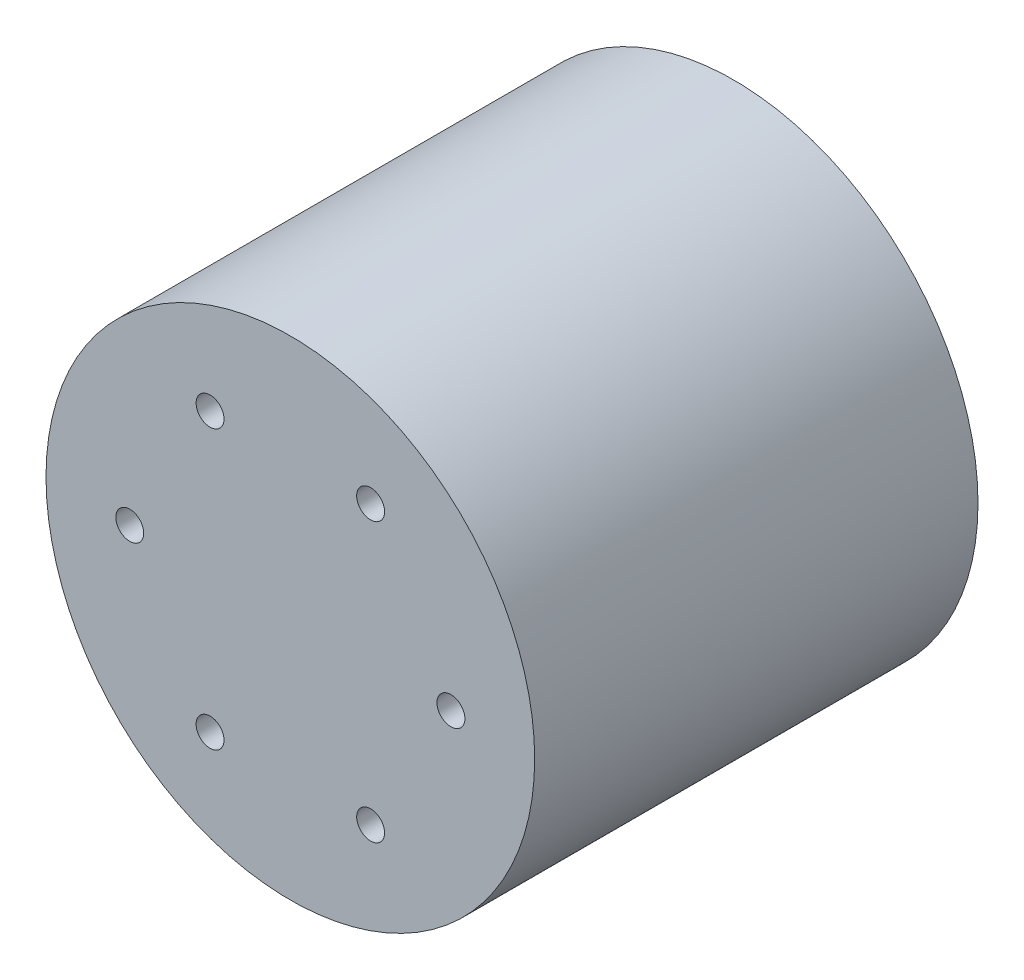
ISO-10303-21;
HEADER;
FILE_DESCRIPTION(('STEP AP214'),'2;1');
FILE_NAME('part.step','',(''),(''),'','','');
FILE_SCHEMA(('AUTOMOTIVE_DESIGN { 1 0 10303 214 1 1 1 1 }'));
ENDSEC;
DATA;
#1=APPLICATION_CONTEXT('core data for automotive mechanical design processes');
#2=APPLICATION_PROTOCOL_DEFINITION('international standard','automotive_design',2000,#1);
#3=PRODUCT_CONTEXT('',#1,'mechanical');
#4=PRODUCT('Part','Part','',(#3));
#5=PRODUCT_RELATED_PRODUCT_CATEGORY('part','',(#4));
#6=PRODUCT_DEFINITION_FORMATION('','',#4);
#7=PRODUCT_DEFINITION_CONTEXT('part definition',#1,'design');
#8=PRODUCT_DEFINITION('design','',#6,#7);
#9=PRODUCT_DEFINITION_SHAPE('','',#8);
#10=(LENGTH_UNIT() NAMED_UNIT(*) SI_UNIT(.MILLI.,.METRE.));
#11=(NAMED_UNIT(*) PLANE_ANGLE_UNIT() SI_UNIT($,.RADIAN.));
#12=(NAMED_UNIT(*) SI_UNIT($,.STERADIAN.) SOLID_ANGLE_UNIT());
#13=UNCERTAINTY_MEASURE_WITH_UNIT(LENGTH_MEASURE(1.E-05),#10,'distance_accuracy_value','');
#14=(GEOMETRIC_REPRESENTATION_CONTEXT(3) GLOBAL_UNCERTAINTY_ASSIGNED_CONTEXT((#13)) GLOBAL_UNIT_ASSIGNED_CONTEXT((#10,
#11,#12)) REPRESENTATION_CONTEXT('',''));
#15=CARTESIAN_POINT('',(0.,0.,0.));
#16=DIRECTION('',(0.,0.,1.));
#17=DIRECTION('',(1.,0.,0.));
#18=AXIS2_PLACEMENT_3D('',#15,#16,#17);
#19=CARTESIAN_POINT('',(0.,0.,63.5));
#20=DIRECTION('',(0.,0.,-1.));
#21=DIRECTION('',(-1.,0.,0.));
#22=AXIS2_PLACEMENT_3D('',#19,#20,#21);
#23=CYLINDRICAL_SURFACE('',#22,35.);
#24=CARTESIAN_POINT('',(0.,0.,63.5));
#25=DIRECTION('',(0.,0.,1.));
#26=DIRECTION('',(1.,0.,0.));
#27=AXIS2_PLACEMENT_3D('',#24,#25,#26);
#28=CIRCLE('',#27,35.);
#29=CARTESIAN_POINT('',(35.,0.,63.5));
#30=VERTEX_POINT('',#29);
#31=EDGE_CURVE('E10',#30,#30,#28,.T.);
#32=ORIENTED_EDGE('',*,*,#31,.F.);
#33=EDGE_LOOP('',(#32));
#34=FACE_BOUND('',#33,.T.);
#35=CARTESIAN_POINT('',(0.,0.,0.));
#36=DIRECTION('',(0.,0.,1.));
#37=DIRECTION('',(1.,0.,0.));
#38=AXIS2_PLACEMENT_3D('',#35,#36,#37);
#39=CIRCLE('',#38,35.);
#40=CARTESIAN_POINT('',(35.,0.,0.));
#41=VERTEX_POINT('',#40);
#42=EDGE_CURVE('E40',#41,#41,#39,.T.);
#43=ORIENTED_EDGE('',*,*,#42,.T.);
#44=EDGE_LOOP('',(#43));
#45=FACE_BOUND('',#44,.T.);
#46=ADVANCED_FACE('F37',(#34,#45),#23,.T.);
#47=CARTESIAN_POINT('',(0.,0.,63.5));
#48=DIRECTION('',(0.,0.,1.));
#49=DIRECTION('',(1.,0.,0.));
#50=AXIS2_PLACEMENT_3D('',#47,#48,#49);
#51=PLANE('',#50);
#52=CARTESIAN_POINT('',(-23.,0.,63.5));
#53=DIRECTION('',(0.,0.,1.));
#54=DIRECTION('',(1.,0.,0.));
#55=AXIS2_PLACEMENT_3D('',#52,#53,#54);
#56=CIRCLE('',#55,2.);
#57=CARTESIAN_POINT('',(-21.,0.,63.5));
#58=VERTEX_POINT('',#57);
#59=EDGE_CURVE('E55',#58,#58,#56,.T.);
#60=ORIENTED_EDGE('',*,*,#59,.F.);
#61=EDGE_LOOP('',(#60));
#62=FACE_BOUND('',#61,.T.);
#63=CARTESIAN_POINT('',(11.5000000000001,19.918584287042,63.5));
#64=DIRECTION('',(0.,0.,1.));
#65=DIRECTION('',(1.,0.,0.));
#66=AXIS2_PLACEMENT_3D('',#63,#64,#65);
#67=CIRCLE('',#66,2.);
#68=CARTESIAN_POINT('',(13.5000000000001,19.918584287042,63.5));
#69=VERTEX_POINT('',#68);
#70=EDGE_CURVE('E62',#69,#69,#67,.T.);
#71=ORIENTED_EDGE('',*,*,#70,.F.);
#72=EDGE_LOOP('',(#71));
#73=FACE_BOUND('',#72,.T.);
#74=CARTESIAN_POINT('',(23.,-1.60608141586784E-13,63.5));
#75=DIRECTION('',(0.,0.,1.));
#76=DIRECTION('',(1.,0.,0.));
#77=AXIS2_PLACEMENT_3D('',#74,#75,#76);
#78=CIRCLE('',#77,2.);
#79=CARTESIAN_POINT('',(25.,-1.60608141586784E-13,63.5));
#80=VERTEX_POINT('',#79);
#81=EDGE_CURVE('E68',#80,#80,#78,.T.);
#82=ORIENTED_EDGE('',*,*,#81,.F.);
#83=EDGE_LOOP('',(#82));
#84=FACE_BOUND('',#83,.T.);
#85=CARTESIAN_POINT('',(11.4999999999998,-19.9185842870422,63.5));
#86=DIRECTION('',(0.,0.,1.));
#87=DIRECTION('',(1.,0.,0.));
#88=AXIS2_PLACEMENT_3D('',#85,#86,#87);
#89=CIRCLE('',#88,2.);
#90=CARTESIAN_POINT('',(13.4999999999998,-19.9185842870422,63.5));
#91=VERTEX_POINT('',#90);
#92=EDGE_CURVE('E74',#91,#91,#89,.T.);
#93=ORIENTED_EDGE('',*,*,#92,.F.);
#94=EDGE_LOOP('',(#93));
#95=FACE_BOUND('',#94,.T.);
#96=CARTESIAN_POINT('',(-11.5000000000002,-19.918584287042,63.5));
#97=DIRECTION('',(0.,0.,1.));
#98=DIRECTION('',(1.,0.,0.));
#99=AXIS2_PLACEMENT_3D('',#96,#97,#98);
#100=CIRCLE('',#99,2.);
#101=CARTESIAN_POINT('',(-9.50000000000023,-19.918584287042,63.5));
#102=VERTEX_POINT('',#101);
#103=EDGE_CURVE('E80',#102,#102,#100,.T.);
#104=ORIENTED_EDGE('',*,*,#103,.F.);
#105=EDGE_LOOP('',(#104));
#106=FACE_BOUND('',#105,.T.);
#107=CARTESIAN_POINT('',(-11.5,19.9185842870421,63.5));
#108=DIRECTION('',(0.,0.,1.));
#109=DIRECTION('',(1.,0.,0.));
#110=AXIS2_PLACEMENT_3D('',#107,#108,#109);
#111=CIRCLE('',#110,2.);
#112=CARTESIAN_POINT('',(-9.49999999999995,19.9185842870421,63.5));
#113=VERTEX_POINT('',#112);
#114=EDGE_CURVE('E49',#113,#113,#111,.T.);
#115=ORIENTED_EDGE('',*,*,#114,.F.);
#116=EDGE_LOOP('',(#115));
#117=FACE_BOUND('',#116,.T.);
#118=ORIENTED_EDGE('',*,*,#31,.T.);
#119=EDGE_LOOP('',(#118));
#120=FACE_BOUND('',#119,.T.);
#121=ADVANCED_FACE('F138',(#62,#73,#84,#95,#106,#117,#120),#51,.T.);
#122=CARTESIAN_POINT('',(0.,0.,0.));
#123=DIRECTION('',(0.,0.,1.));
#124=DIRECTION('',(1.,0.,0.));
#125=AXIS2_PLACEMENT_3D('',#122,#123,#124);
#126=PLANE('',#125);
#127=CARTESIAN_POINT('',(-23.,0.,0.));
#128=DIRECTION('',(0.,0.,1.));
#129=DIRECTION('',(1.,0.,0.));
#130=AXIS2_PLACEMENT_3D('',#127,#128,#129);
#131=CIRCLE('',#130,2.);
#132=CARTESIAN_POINT('',(-21.,0.,0.));
#133=VERTEX_POINT('',#132);
#134=EDGE_CURVE('E91',#133,#133,#131,.T.);
#135=ORIENTED_EDGE('',*,*,#134,.T.);
#136=EDGE_LOOP('',(#135));
#137=FACE_BOUND('',#136,.T.);
#138=CARTESIAN_POINT('',(11.5000000000001,19.918584287042,0.));
#139=DIRECTION('',(0.,0.,1.));
#140=DIRECTION('',(1.,0.,0.));
#141=AXIS2_PLACEMENT_3D('',#138,#139,#140);
#142=CIRCLE('',#141,2.);
#143=CARTESIAN_POINT('',(13.5000000000001,19.918584287042,0.));
#144=VERTEX_POINT('',#143);
#145=EDGE_CURVE('E97',#144,#144,#142,.T.);
#146=ORIENTED_EDGE('',*,*,#145,.T.);
#147=EDGE_LOOP('',(#146));
#148=FACE_BOUND('',#147,.T.);
#149=CARTESIAN_POINT('',(23.,-1.60608141586784E-13,0.));
#150=DIRECTION('',(0.,0.,1.));
#151=DIRECTION('',(1.,0.,0.));
#152=AXIS2_PLACEMENT_3D('',#149,#150,#151);
#153=CIRCLE('',#152,2.);
#154=CARTESIAN_POINT('',(25.,-1.60608141586784E-13,0.));
#155=VERTEX_POINT('',#154);
#156=EDGE_CURVE('E103',#155,#155,#153,.T.);
#157=ORIENTED_EDGE('',*,*,#156,.T.);
#158=EDGE_LOOP('',(#157));
#159=FACE_BOUND('',#158,.T.);
#160=CARTESIAN_POINT('',(11.4999999999998,-19.9185842870422,0.));
#161=DIRECTION('',(0.,0.,1.));
#162=DIRECTION('',(1.,0.,0.));
#163=AXIS2_PLACEMENT_3D('',#160,#161,#162);
#164=CIRCLE('',#163,2.);
#165=CARTESIAN_POINT('',(13.4999999999998,-19.9185842870422,0.));
#166=VERTEX_POINT('',#165);
#167=EDGE_CURVE('E109',#166,#166,#164,.T.);
#168=ORIENTED_EDGE('',*,*,#167,.T.);
#169=EDGE_LOOP('',(#168));
#170=FACE_BOUND('',#169,.T.);
#171=CARTESIAN_POINT('',(-11.5000000000002,-19.918584287042,0.));
#172=DIRECTION('',(0.,0.,1.));
#173=DIRECTION('',(1.,0.,0.));
#174=AXIS2_PLACEMENT_3D('',#171,#172,#173);
#175=CIRCLE('',#174,2.);
#176=CARTESIAN_POINT('',(-9.50000000000023,-19.918584287042,0.));
#177=VERTEX_POINT('',#176);
#178=EDGE_CURVE('E115',#177,#177,#175,.T.);
#179=ORIENTED_EDGE('',*,*,#178,.T.);
#180=EDGE_LOOP('',(#179));
#181=FACE_BOUND('',#180,.T.);
#182=CARTESIAN_POINT('',(-11.5,19.9185842870421,0.));
#183=DIRECTION('',(0.,0.,1.));
#184=DIRECTION('',(1.,0.,0.));
#185=AXIS2_PLACEMENT_3D('',#182,#183,#184);
#186=CIRCLE('',#185,2.);
#187=CARTESIAN_POINT('',(-9.49999999999995,19.9185842870421,0.));
#188=VERTEX_POINT('',#187);
#189=EDGE_CURVE('E85',#188,#188,#186,.T.);
#190=ORIENTED_EDGE('',*,*,#189,.T.);
#191=EDGE_LOOP('',(#190));
#192=FACE_BOUND('',#191,.T.);
#193=ORIENTED_EDGE('',*,*,#42,.F.);
#194=EDGE_LOOP('',(#193));
#195=FACE_BOUND('',#194,.T.);
#196=ADVANCED_FACE('F143',(#137,#148,#159,#170,#181,#192,#195),#126,.F.);
#197=CARTESIAN_POINT('',(-11.5,19.9185842870421,43.5));
#198=DIRECTION('',(0.,0.,1.));
#199=DIRECTION('',(1.,0.,0.));
#200=AXIS2_PLACEMENT_3D('',#197,#198,#199);
#201=CYLINDRICAL_SURFACE('',#200,2.);
#202=CARTESIAN_POINT('',(-11.5,19.9185842870421,43.5));
#203=DIRECTION('',(0.,0.,1.));
#204=DIRECTION('',(1.,0.,0.));
#205=AXIS2_PLACEMENT_3D('',#202,#203,#204);
#206=CIRCLE('',#205,2.);
#207=CARTESIAN_POINT('',(-9.49999999999995,19.9185842870421,43.5));
#208=VERTEX_POINT('',#207);
#209=EDGE_CURVE('E47',#208,#208,#206,.T.);
#210=ORIENTED_EDGE('',*,*,#209,.F.);
#211=EDGE_LOOP('',(#210));
#212=FACE_BOUND('',#211,.T.);
#213=ORIENTED_EDGE('',*,*,#114,.T.);
#214=EDGE_LOOP('',(#213));
#215=FACE_BOUND('',#214,.T.);
#216=ADVANCED_FACE('F150',(#212,#215),#201,.F.);
#217=CARTESIAN_POINT('',(0.,0.,43.5));
#218=DIRECTION('',(0.,0.,1.));
#219=DIRECTION('',(1.,0.,0.));
#220=AXIS2_PLACEMENT_3D('',#217,#218,#219);
#221=PLANE('',#220);
#222=ORIENTED_EDGE('',*,*,#209,.T.);
#223=EDGE_LOOP('',(#222));
#224=FACE_BOUND('',#223,.T.);
#225=ADVANCED_FACE('F157',(#224),#221,.T.);
#226=CARTESIAN_POINT('',(-11.5000000000002,-19.918584287042,43.5));
#227=DIRECTION('',(0.,0.,1.));
#228=DIRECTION('',(1.,0.,0.));
#229=AXIS2_PLACEMENT_3D('',#226,#227,#228);
#230=CYLINDRICAL_SURFACE('',#229,2.);
#231=CARTESIAN_POINT('',(-11.5000000000002,-19.918584287042,43.5));
#232=DIRECTION('',(0.,0.,1.));
#233=DIRECTION('',(1.,0.,0.));
#234=AXIS2_PLACEMENT_3D('',#231,#232,#233);
#235=CIRCLE('',#234,2.);
#236=CARTESIAN_POINT('',(-9.50000000000023,-19.918584287042,43.5));
#237=VERTEX_POINT('',#236);
#238=EDGE_CURVE('E52',#237,#237,#235,.T.);
#239=ORIENTED_EDGE('',*,*,#238,.F.);
#240=EDGE_LOOP('',(#239));
#241=FACE_BOUND('',#240,.T.);
#242=ORIENTED_EDGE('',*,*,#103,.T.);
#243=EDGE_LOOP('',(#242));
#244=FACE_BOUND('',#243,.T.);
#245=ADVANCED_FACE('F164',(#241,#244),#230,.F.);
#246=CARTESIAN_POINT('',(0.,0.,43.5));
#247=DIRECTION('',(0.,0.,1.));
#248=DIRECTION('',(1.,0.,0.));
#249=AXIS2_PLACEMENT_3D('',#246,#247,#248);
#250=PLANE('',#249);
#251=ORIENTED_EDGE('',*,*,#238,.T.);
#252=EDGE_LOOP('',(#251));
#253=FACE_BOUND('',#252,.T.);
#254=ADVANCED_FACE('F194',(#253),#250,.T.);
#255=CARTESIAN_POINT('',(11.4999999999998,-19.9185842870422,43.5));
#256=DIRECTION('',(0.,0.,1.));
#257=DIRECTION('',(1.,0.,0.));
#258=AXIS2_PLACEMENT_3D('',#255,#256,#257);
#259=CYLINDRICAL_SURFACE('',#258,2.);
#260=CARTESIAN_POINT('',(11.4999999999998,-19.9185842870422,43.5));
#261=DIRECTION('',(0.,0.,1.));
#262=DIRECTION('',(1.,0.,0.));
#263=AXIS2_PLACEMENT_3D('',#260,#261,#262);
#264=CIRCLE('',#263,2.);
#265=CARTESIAN_POINT('',(13.4999999999998,-19.9185842870422,43.5));
#266=VERTEX_POINT('',#265);
#267=EDGE_CURVE('E77',#266,#266,#264,.T.);
#268=ORIENTED_EDGE('',*,*,#267,.F.);
#269=EDGE_LOOP('',(#268));
#270=FACE_BOUND('',#269,.T.);
#271=ORIENTED_EDGE('',*,*,#92,.T.);
#272=EDGE_LOOP('',(#271));
#273=FACE_BOUND('',#272,.T.);
#274=ADVANCED_FACE('F191',(#270,#273),#259,.F.);
#275=CARTESIAN_POINT('',(0.,0.,43.5));
#276=DIRECTION('',(0.,0.,1.));
#277=DIRECTION('',(1.,0.,0.));
#278=AXIS2_PLACEMENT_3D('',#275,#276,#277);
#279=PLANE('',#278);
#280=ORIENTED_EDGE('',*,*,#267,.T.);
#281=EDGE_LOOP('',(#280));
#282=FACE_BOUND('',#281,.T.);
#283=ADVANCED_FACE('F186',(#282),#279,.T.);
#284=CARTESIAN_POINT('',(23.,-1.60608141586784E-13,43.5));
#285=DIRECTION('',(0.,0.,1.));
#286=DIRECTION('',(1.,0.,0.));
#287=AXIS2_PLACEMENT_3D('',#284,#285,#286);
#288=CYLINDRICAL_SURFACE('',#287,2.);
#289=CARTESIAN_POINT('',(23.,-1.60608141586784E-13,43.5));
#290=DIRECTION('',(0.,0.,1.));
#291=DIRECTION('',(1.,0.,0.));
#292=AXIS2_PLACEMENT_3D('',#289,#290,#291);
#293=CIRCLE('',#292,2.);
#294=CARTESIAN_POINT('',(25.,-1.60608141586784E-13,43.5));
#295=VERTEX_POINT('',#294);
#296=EDGE_CURVE('E71',#295,#295,#293,.T.);
#297=ORIENTED_EDGE('',*,*,#296,.F.);
#298=EDGE_LOOP('',(#297));
#299=FACE_BOUND('',#298,.T.);
#300=ORIENTED_EDGE('',*,*,#81,.T.);
#301=EDGE_LOOP('',(#300));
#302=FACE_BOUND('',#301,.T.);
#303=ADVANCED_FACE('F183',(#299,#302),#288,.F.);
#304=CARTESIAN_POINT('',(0.,0.,43.5));
#305=DIRECTION('',(0.,0.,1.));
#306=DIRECTION('',(1.,0.,0.));
#307=AXIS2_PLACEMENT_3D('',#304,#305,#306);
#308=PLANE('',#307);
#309=ORIENTED_EDGE('',*,*,#296,.T.);
#310=EDGE_LOOP('',(#309));
#311=FACE_BOUND('',#310,.T.);
#312=ADVANCED_FACE('F178',(#311),#308,.T.);
#313=CARTESIAN_POINT('',(11.5000000000001,19.918584287042,43.5));
#314=DIRECTION('',(0.,0.,1.));
#315=DIRECTION('',(1.,0.,0.));
#316=AXIS2_PLACEMENT_3D('',#313,#314,#315);
#317=CYLINDRICAL_SURFACE('',#316,2.);
#318=CARTESIAN_POINT('',(11.5000000000001,19.918584287042,43.5));
#319=DIRECTION('',(0.,0.,1.));
#320=DIRECTION('',(1.,0.,0.));
#321=AXIS2_PLACEMENT_3D('',#318,#319,#320);
#322=CIRCLE('',#321,2.);
#323=CARTESIAN_POINT('',(13.5000000000001,19.918584287042,43.5));
#324=VERTEX_POINT('',#323);
#325=EDGE_CURVE('E65',#324,#324,#322,.T.);
#326=ORIENTED_EDGE('',*,*,#325,.F.);
#327=EDGE_LOOP('',(#326));
#328=FACE_BOUND('',#327,.T.);
#329=ORIENTED_EDGE('',*,*,#70,.T.);
#330=EDGE_LOOP('',(#329));
#331=FACE_BOUND('',#330,.T.);
#332=ADVANCED_FACE('F175',(#328,#331),#317,.F.);
#333=CARTESIAN_POINT('',(0.,0.,43.5));
#334=DIRECTION('',(0.,0.,1.));
#335=DIRECTION('',(1.,0.,0.));
#336=AXIS2_PLACEMENT_3D('',#333,#334,#335);
#337=PLANE('',#336);
#338=ORIENTED_EDGE('',*,*,#325,.T.);
#339=EDGE_LOOP('',(#338));
#340=FACE_BOUND('',#339,.T.);
#341=ADVANCED_FACE('F170',(#340),#337,.T.);
#342=CARTESIAN_POINT('',(-23.,0.,43.5));
#343=DIRECTION('',(0.,0.,1.));
#344=DIRECTION('',(1.,0.,0.));
#345=AXIS2_PLACEMENT_3D('',#342,#343,#344);
#346=CYLINDRICAL_SURFACE('',#345,2.);
#347=CARTESIAN_POINT('',(-23.,0.,43.5));
#348=DIRECTION('',(0.,0.,1.));
#349=DIRECTION('',(1.,0.,0.));
#350=AXIS2_PLACEMENT_3D('',#347,#348,#349);
#351=CIRCLE('',#350,2.);
#352=CARTESIAN_POINT('',(-21.,0.,43.5));
#353=VERTEX_POINT('',#352);
#354=EDGE_CURVE('E58',#353,#353,#351,.T.);
#355=ORIENTED_EDGE('',*,*,#354,.F.);
#356=EDGE_LOOP('',(#355));
#357=FACE_BOUND('',#356,.T.);
#358=ORIENTED_EDGE('',*,*,#59,.T.);
#359=EDGE_LOOP('',(#358));
#360=FACE_BOUND('',#359,.T.);
#361=ADVANCED_FACE('F166',(#357,#360),#346,.F.);
#362=CARTESIAN_POINT('',(0.,0.,43.5));
#363=DIRECTION('',(0.,0.,1.));
#364=DIRECTION('',(1.,0.,0.));
#365=AXIS2_PLACEMENT_3D('',#362,#363,#364);
#366=PLANE('',#365);
#367=ORIENTED_EDGE('',*,*,#354,.T.);
#368=EDGE_LOOP('',(#367));
#369=FACE_BOUND('',#368,.T.);
#370=ADVANCED_FACE('F169',(#369),#366,.T.);
#371=CARTESIAN_POINT('',(-11.5,19.9185842870421,20.));
#372=DIRECTION('',(0.,0.,-1.));
#373=DIRECTION('',(-1.,0.,0.));
#374=AXIS2_PLACEMENT_3D('',#371,#372,#373);
#375=CYLINDRICAL_SURFACE('',#374,2.);
#376=CARTESIAN_POINT('',(-11.5,19.9185842870421,20.));
#377=DIRECTION('',(0.,0.,1.));
#378=DIRECTION('',(1.,0.,0.));
#379=AXIS2_PLACEMENT_3D('',#376,#377,#378);
#380=CIRCLE('',#379,2.);
#381=CARTESIAN_POINT('',(-9.49999999999995,19.9185842870421,20.));
#382=VERTEX_POINT('',#381);
#383=EDGE_CURVE('E59',#382,#382,#380,.T.);
#384=ORIENTED_EDGE('',*,*,#383,.T.);
#385=EDGE_LOOP('',(#384));
#386=FACE_BOUND('',#385,.T.);
#387=ORIENTED_EDGE('',*,*,#189,.F.);
#388=EDGE_LOOP('',(#387));
#389=FACE_BOUND('',#388,.T.);
#390=ADVANCED_FACE('F173',(#386,#389),#375,.F.);
#391=CARTESIAN_POINT('',(0.,0.,20.));
#392=DIRECTION('',(0.,0.,-1.));
#393=DIRECTION('',(1.,0.,0.));
#394=AXIS2_PLACEMENT_3D('',#391,#392,#393);
#395=PLANE('',#394);
#396=ORIENTED_EDGE('',*,*,#383,.F.);
#397=EDGE_LOOP('',(#396));
#398=FACE_BOUND('',#397,.T.);
#399=ADVANCED_FACE('F135',(#398),#395,.T.);
#400=CARTESIAN_POINT('',(-11.5000000000002,-19.918584287042,20.));
#401=DIRECTION('',(0.,0.,-1.));
#402=DIRECTION('',(-1.,0.,0.));
#403=AXIS2_PLACEMENT_3D('',#400,#401,#402);
#404=CYLINDRICAL_SURFACE('',#403,2.);
#405=CARTESIAN_POINT('',(-11.5000000000002,-19.918584287042,20.));
#406=DIRECTION('',(0.,0.,1.));
#407=DIRECTION('',(1.,0.,0.));
#408=AXIS2_PLACEMENT_3D('',#405,#406,#407);
#409=CIRCLE('',#408,2.);
#410=CARTESIAN_POINT('',(-9.50000000000023,-19.918584287042,20.));
#411=VERTEX_POINT('',#410);
#412=EDGE_CURVE('E88',#411,#411,#409,.T.);
#413=ORIENTED_EDGE('',*,*,#412,.T.);
#414=EDGE_LOOP('',(#413));
#415=FACE_BOUND('',#414,.T.);
#416=ORIENTED_EDGE('',*,*,#178,.F.);
#417=EDGE_LOOP('',(#416));
#418=FACE_BOUND('',#417,.T.);
#419=ADVANCED_FACE('F121',(#415,#418),#404,.F.);
#420=CARTESIAN_POINT('',(0.,0.,20.));
#421=DIRECTION('',(0.,0.,-1.));
#422=DIRECTION('',(1.,0.,0.));
#423=AXIS2_PLACEMENT_3D('',#420,#421,#422);
#424=PLANE('',#423);
#425=ORIENTED_EDGE('',*,*,#412,.F.);
#426=EDGE_LOOP('',(#425));
#427=FACE_BOUND('',#426,.T.);
#428=ADVANCED_FACE('F124',(#427),#424,.T.);
#429=CARTESIAN_POINT('',(11.4999999999998,-19.9185842870422,20.));
#430=DIRECTION('',(0.,0.,-1.));
#431=DIRECTION('',(-1.,0.,0.));
#432=AXIS2_PLACEMENT_3D('',#429,#430,#431);
#433=CYLINDRICAL_SURFACE('',#432,2.);
#434=CARTESIAN_POINT('',(11.4999999999998,-19.9185842870422,20.));
#435=DIRECTION('',(0.,0.,1.));
#436=DIRECTION('',(1.,0.,0.));
#437=AXIS2_PLACEMENT_3D('',#434,#435,#436);
#438=CIRCLE('',#437,2.);
#439=CARTESIAN_POINT('',(13.4999999999998,-19.9185842870422,20.));
#440=VERTEX_POINT('',#439);
#441=EDGE_CURVE('E112',#440,#440,#438,.T.);
#442=ORIENTED_EDGE('',*,*,#441,.T.);
#443=EDGE_LOOP('',(#442));
#444=FACE_BOUND('',#443,.T.);
#445=ORIENTED_EDGE('',*,*,#167,.F.);
#446=EDGE_LOOP('',(#445));
#447=FACE_BOUND('',#446,.T.);
#448=ADVANCED_FACE('F126',(#444,#447),#433,.F.);
#449=CARTESIAN_POINT('',(0.,0.,20.));
#450=DIRECTION('',(0.,0.,-1.));
#451=DIRECTION('',(1.,0.,0.));
#452=AXIS2_PLACEMENT_3D('',#449,#450,#451);
#453=PLANE('',#452);
#454=ORIENTED_EDGE('',*,*,#441,.F.);
#455=EDGE_LOOP('',(#454));
#456=FACE_BOUND('',#455,.T.);
#457=ADVANCED_FACE('F132',(#456),#453,.T.);
#458=CARTESIAN_POINT('',(23.,-1.60608141586784E-13,20.));
#459=DIRECTION('',(0.,0.,-1.));
#460=DIRECTION('',(-1.,0.,0.));
#461=AXIS2_PLACEMENT_3D('',#458,#459,#460);
#462=CYLINDRICAL_SURFACE('',#461,2.);
#463=CARTESIAN_POINT('',(23.,-1.60608141586784E-13,20.));
#464=DIRECTION('',(0.,0.,1.));
#465=DIRECTION('',(1.,0.,0.));
#466=AXIS2_PLACEMENT_3D('',#463,#464,#465);
#467=CIRCLE('',#466,2.);
#468=CARTESIAN_POINT('',(25.,-1.60608141586784E-13,20.));
#469=VERTEX_POINT('',#468);
#470=EDGE_CURVE('E106',#469,#469,#467,.T.);
#471=ORIENTED_EDGE('',*,*,#470,.T.);
#472=EDGE_LOOP('',(#471));
#473=FACE_BOUND('',#472,.T.);
#474=ORIENTED_EDGE('',*,*,#156,.F.);
#475=EDGE_LOOP('',(#474));
#476=FACE_BOUND('',#475,.T.);
#477=ADVANCED_FACE('F227',(#473,#476),#462,.F.);
#478=CARTESIAN_POINT('',(0.,0.,20.));
#479=DIRECTION('',(0.,0.,-1.));
#480=DIRECTION('',(1.,0.,0.));
#481=AXIS2_PLACEMENT_3D('',#478,#479,#480);
#482=PLANE('',#481);
#483=ORIENTED_EDGE('',*,*,#470,.F.);
#484=EDGE_LOOP('',(#483));
#485=FACE_BOUND('',#484,.T.);
#486=ADVANCED_FACE('F222',(#485),#482,.T.);
#487=CARTESIAN_POINT('',(11.5000000000001,19.918584287042,20.));
#488=DIRECTION('',(0.,0.,-1.));
#489=DIRECTION('',(-1.,0.,0.));
#490=AXIS2_PLACEMENT_3D('',#487,#488,#489);
#491=CYLINDRICAL_SURFACE('',#490,2.);
#492=CARTESIAN_POINT('',(11.5000000000001,19.918584287042,20.));
#493=DIRECTION('',(0.,0.,1.));
#494=DIRECTION('',(1.,0.,0.));
#495=AXIS2_PLACEMENT_3D('',#492,#493,#494);
#496=CIRCLE('',#495,2.);
#497=CARTESIAN_POINT('',(13.5000000000001,19.918584287042,20.));
#498=VERTEX_POINT('',#497);
#499=EDGE_CURVE('E100',#498,#498,#496,.T.);
#500=ORIENTED_EDGE('',*,*,#499,.T.);
#501=EDGE_LOOP('',(#500));
#502=FACE_BOUND('',#501,.T.);
#503=ORIENTED_EDGE('',*,*,#145,.F.);
#504=EDGE_LOOP('',(#503));
#505=FACE_BOUND('',#504,.T.);
#506=ADVANCED_FACE('F219',(#502,#505),#491,.F.);
#507=CARTESIAN_POINT('',(0.,0.,20.));
#508=DIRECTION('',(0.,0.,-1.));
#509=DIRECTION('',(1.,0.,0.));
#510=AXIS2_PLACEMENT_3D('',#507,#508,#509);
#511=PLANE('',#510);
#512=ORIENTED_EDGE('',*,*,#499,.F.);
#513=EDGE_LOOP('',(#512));
#514=FACE_BOUND('',#513,.T.);
#515=ADVANCED_FACE('F214',(#514),#511,.T.);
#516=CARTESIAN_POINT('',(-23.,0.,20.));
#517=DIRECTION('',(0.,0.,-1.));
#518=DIRECTION('',(-1.,0.,0.));
#519=AXIS2_PLACEMENT_3D('',#516,#517,#518);
#520=CYLINDRICAL_SURFACE('',#519,2.);
#521=CARTESIAN_POINT('',(-23.,0.,20.));
#522=DIRECTION('',(0.,0.,1.));
#523=DIRECTION('',(1.,0.,0.));
#524=AXIS2_PLACEMENT_3D('',#521,#522,#523);
#525=CIRCLE('',#524,2.);
#526=CARTESIAN_POINT('',(-21.,0.,20.));
#527=VERTEX_POINT('',#526);
#528=EDGE_CURVE('E94',#527,#527,#525,.T.);
#529=ORIENTED_EDGE('',*,*,#528,.T.);
#530=EDGE_LOOP('',(#529));
#531=FACE_BOUND('',#530,.T.);
#532=ORIENTED_EDGE('',*,*,#134,.F.);
#533=EDGE_LOOP('',(#532));
#534=FACE_BOUND('',#533,.T.);
#535=ADVANCED_FACE('F210',(#531,#534),#520,.F.);
#536=CARTESIAN_POINT('',(0.,0.,20.));
#537=DIRECTION('',(0.,0.,-1.));
#538=DIRECTION('',(1.,0.,0.));
#539=AXIS2_PLACEMENT_3D('',#536,#537,#538);
#540=PLANE('',#539);
#541=ORIENTED_EDGE('',*,*,#528,.F.);
#542=EDGE_LOOP('',(#541));
#543=FACE_BOUND('',#542,.T.);
#544=ADVANCED_FACE('F213',(#543),#540,.T.);
#545=CLOSED_SHELL('',(#46,#121,#196,#216,#225,#245,#254,#274,#283,#303,#312,#332,#341,#361,#370,
#390,#399,#419,#428,#448,#457,#477,#486,#506,#515,#535,#544));
#546=MANIFOLD_SOLID_BREP('B2',#545);
#547=ADVANCED_BREP_SHAPE_REPRESENTATION('',(#18,#546),#14);
#548=SHAPE_DEFINITION_REPRESENTATION(#9,#547);
ENDSEC;
END-ISO-10303-21;
